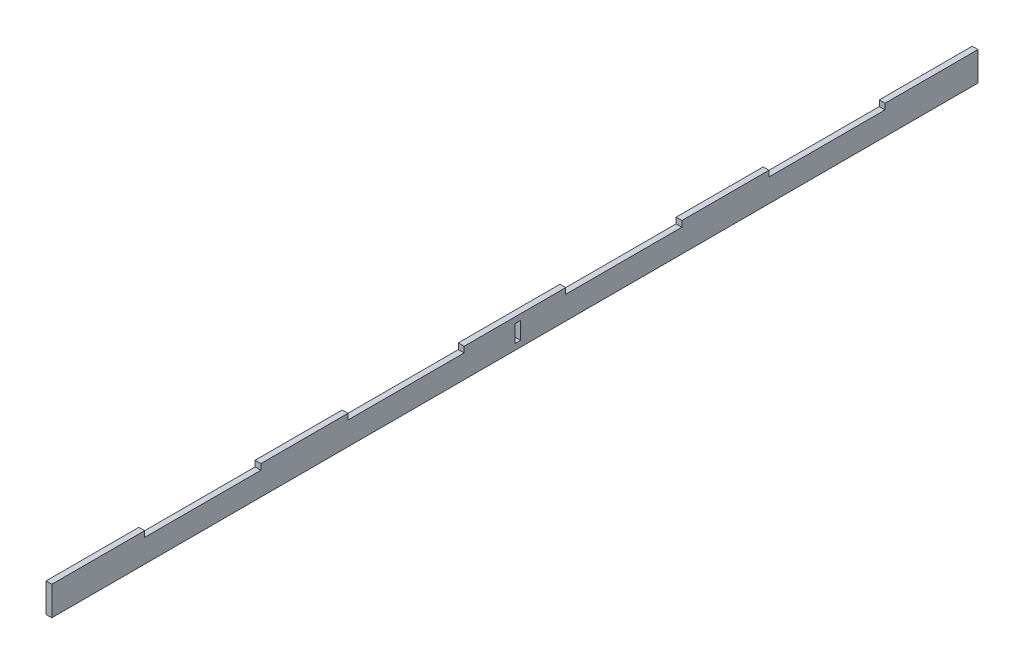
ISO-10303-21;
HEADER;
FILE_DESCRIPTION(('STEP AP214'),'2;1');
FILE_NAME('part.step','',(''),(''),'','','');
FILE_SCHEMA(('AUTOMOTIVE_DESIGN { 1 0 10303 214 1 1 1 1 }'));
ENDSEC;
DATA;
#1=APPLICATION_CONTEXT('core data for automotive mechanical design processes');
#2=APPLICATION_PROTOCOL_DEFINITION('international standard','automotive_design',2000,#1);
#3=PRODUCT_CONTEXT('',#1,'mechanical');
#4=PRODUCT('Part','Part','',(#3));
#5=PRODUCT_RELATED_PRODUCT_CATEGORY('part','',(#4));
#6=PRODUCT_DEFINITION_FORMATION('','',#4);
#7=PRODUCT_DEFINITION_CONTEXT('part definition',#1,'design');
#8=PRODUCT_DEFINITION('design','',#6,#7);
#9=PRODUCT_DEFINITION_SHAPE('','',#8);
#10=(LENGTH_UNIT() NAMED_UNIT(*) SI_UNIT(.MILLI.,.METRE.));
#11=(NAMED_UNIT(*) PLANE_ANGLE_UNIT() SI_UNIT($,.RADIAN.));
#12=(NAMED_UNIT(*) SI_UNIT($,.STERADIAN.) SOLID_ANGLE_UNIT());
#13=UNCERTAINTY_MEASURE_WITH_UNIT(LENGTH_MEASURE(1.E-05),#10,'distance_accuracy_value','');
#14=(GEOMETRIC_REPRESENTATION_CONTEXT(3) GLOBAL_UNCERTAINTY_ASSIGNED_CONTEXT((#13)) GLOBAL_UNIT_ASSIGNED_CONTEXT((#10,
#11,#12)) REPRESENTATION_CONTEXT('',''));
#15=CARTESIAN_POINT('',(0.,0.,0.));
#16=DIRECTION('',(0.,0.,1.));
#17=DIRECTION('',(1.,0.,0.));
#18=AXIS2_PLACEMENT_3D('',#15,#16,#17);
#19=CARTESIAN_POINT('',(2.,5.,159.5));
#20=DIRECTION('',(0.,-1.,0.));
#21=DIRECTION('',(0.,0.,-1.));
#22=AXIS2_PLACEMENT_3D('',#19,#20,#21);
#23=PLANE('',#22);
#24=DIRECTION('',(0.,0.,1.));
#25=VECTOR('',#24,1.);
#26=CARTESIAN_POINT('',(2.,5.,159.5));
#27=LINE('',#26,#25);
#28=CARTESIAN_POINT('',(2.,5.,127.5));
#29=VERTEX_POINT('',#28);
#30=CARTESIAN_POINT('',(2.,5.,159.5));
#31=VERTEX_POINT('',#30);
#32=EDGE_CURVE('E352',#29,#31,#27,.T.);
#33=ORIENTED_EDGE('',*,*,#32,.F.);
#34=DIRECTION('',(1.,0.,0.));
#35=VECTOR('',#34,1.);
#36=CARTESIAN_POINT('',(0.,5.,127.5));
#37=LINE('',#36,#35);
#38=CARTESIAN_POINT('',(0.,5.,127.5));
#39=VERTEX_POINT('',#38);
#40=EDGE_CURVE('E244',#39,#29,#37,.T.);
#41=ORIENTED_EDGE('',*,*,#40,.F.);
#42=DIRECTION('',(0.,0.,1.));
#43=VECTOR('',#42,1.);
#44=CARTESIAN_POINT('',(0.,5.,159.5));
#45=LINE('',#44,#43);
#46=CARTESIAN_POINT('',(0.,5.,159.5));
#47=VERTEX_POINT('',#46);
#48=EDGE_CURVE('E365',#39,#47,#45,.T.);
#49=ORIENTED_EDGE('',*,*,#48,.T.);
#50=DIRECTION('',(-1.,0.,0.));
#51=VECTOR('',#50,1.);
#52=CARTESIAN_POINT('',(2.,5.,159.5));
#53=LINE('',#52,#51);
#54=EDGE_CURVE('E41',#31,#47,#53,.T.);
#55=ORIENTED_EDGE('',*,*,#54,.F.);
#56=EDGE_LOOP('',(#33,#41,#49,#55));
#57=FACE_BOUND('',#56,.T.);
#58=ADVANCED_FACE('F33',(#57),#23,.F.);
#59=CARTESIAN_POINT('',(0.,5.,57.4999999999999));
#60=VERTEX_POINT('',#59);
#61=CARTESIAN_POINT('',(0.,5.,87.4999999999999));
#62=VERTEX_POINT('',#61);
#63=EDGE_CURVE('E438',#60,#62,#45,.T.);
#64=ORIENTED_EDGE('',*,*,#63,.T.);
#65=DIRECTION('',(1.,0.,0.));
#66=VECTOR('',#65,1.);
#67=CARTESIAN_POINT('',(0.,5.,87.4999999999999));
#68=LINE('',#67,#66);
#69=CARTESIAN_POINT('',(2.,5.,87.4999999999999));
#70=VERTEX_POINT('',#69);
#71=EDGE_CURVE('E247',#62,#70,#68,.T.);
#72=ORIENTED_EDGE('',*,*,#71,.T.);
#73=CARTESIAN_POINT('',(2.,5.,57.4999999999999));
#74=VERTEX_POINT('',#73);
#75=EDGE_CURVE('E399',#74,#70,#27,.T.);
#76=ORIENTED_EDGE('',*,*,#75,.F.);
#77=DIRECTION('',(1.,0.,0.));
#78=VECTOR('',#77,1.);
#79=CARTESIAN_POINT('',(0.,5.,57.4999999999999));
#80=LINE('',#79,#78);
#81=EDGE_CURVE('E237',#60,#74,#80,.T.);
#82=ORIENTED_EDGE('',*,*,#81,.F.);
#83=EDGE_LOOP('',(#64,#72,#76,#82));
#84=FACE_BOUND('',#83,.T.);
#85=ADVANCED_FACE('F437',(#84),#23,.F.);
#86=CARTESIAN_POINT('',(0.,5.,-87.4999999999999));
#87=VERTEX_POINT('',#86);
#88=CARTESIAN_POINT('',(0.,5.,-57.4999999999999));
#89=VERTEX_POINT('',#88);
#90=EDGE_CURVE('E370',#87,#89,#45,.T.);
#91=ORIENTED_EDGE('',*,*,#90,.T.);
#92=DIRECTION('',(1.,0.,0.));
#93=VECTOR('',#92,1.);
#94=CARTESIAN_POINT('',(0.,5.,-57.4999999999999));
#95=LINE('',#94,#93);
#96=CARTESIAN_POINT('',(2.,5.,-57.4999999999999));
#97=VERTEX_POINT('',#96);
#98=EDGE_CURVE('E259',#89,#97,#95,.T.);
#99=ORIENTED_EDGE('',*,*,#98,.T.);
#100=CARTESIAN_POINT('',(2.,5.,-87.4999999999999));
#101=VERTEX_POINT('',#100);
#102=EDGE_CURVE('E358',#101,#97,#27,.T.);
#103=ORIENTED_EDGE('',*,*,#102,.F.);
#104=DIRECTION('',(1.,0.,0.));
#105=VECTOR('',#104,1.);
#106=CARTESIAN_POINT('',(0.,5.,-87.4999999999999));
#107=LINE('',#106,#105);
#108=EDGE_CURVE('E303',#87,#101,#107,.T.);
#109=ORIENTED_EDGE('',*,*,#108,.F.);
#110=EDGE_LOOP('',(#91,#99,#103,#109));
#111=FACE_BOUND('',#110,.T.);
#112=ADVANCED_FACE('F410',(#111),#23,.F.);
#113=CARTESIAN_POINT('',(0.,5.,-159.5));
#114=VERTEX_POINT('',#113);
#115=CARTESIAN_POINT('',(0.,5.,-127.5));
#116=VERTEX_POINT('',#115);
#117=EDGE_CURVE('E366',#114,#116,#45,.T.);
#118=ORIENTED_EDGE('',*,*,#117,.T.);
#119=DIRECTION('',(1.,0.,0.));
#120=VECTOR('',#119,1.);
#121=CARTESIAN_POINT('',(0.,5.,-127.5));
#122=LINE('',#121,#120);
#123=CARTESIAN_POINT('',(2.,5.,-127.5));
#124=VERTEX_POINT('',#123);
#125=EDGE_CURVE('E279',#116,#124,#122,.T.);
#126=ORIENTED_EDGE('',*,*,#125,.T.);
#127=CARTESIAN_POINT('',(2.,5.,-159.5));
#128=VERTEX_POINT('',#127);
#129=EDGE_CURVE('E354',#128,#124,#27,.T.);
#130=ORIENTED_EDGE('',*,*,#129,.F.);
#131=DIRECTION('',(-1.,0.,0.));
#132=VECTOR('',#131,1.);
#133=CARTESIAN_POINT('',(2.,5.,-159.5));
#134=LINE('',#133,#132);
#135=EDGE_CURVE('E11',#128,#114,#134,.T.);
#136=ORIENTED_EDGE('',*,*,#135,.T.);
#137=EDGE_LOOP('',(#118,#126,#130,#136));
#138=FACE_BOUND('',#137,.T.);
#139=ADVANCED_FACE('F453',(#138),#23,.F.);
#140=CARTESIAN_POINT('',(2.,-5.,-159.5));
#141=DIRECTION('',(0.,0.,1.));
#142=DIRECTION('',(1.,0.,0.));
#143=AXIS2_PLACEMENT_3D('',#140,#141,#142);
#144=PLANE('',#143);
#145=DIRECTION('',(0.,1.,0.));
#146=VECTOR('',#145,1.);
#147=CARTESIAN_POINT('',(0.,-5.,-159.5));
#148=LINE('',#147,#146);
#149=CARTESIAN_POINT('',(0.,-5.,-159.5));
#150=VERTEX_POINT('',#149);
#151=EDGE_CURVE('E348',#150,#114,#148,.T.);
#152=ORIENTED_EDGE('',*,*,#151,.T.);
#153=ORIENTED_EDGE('',*,*,#135,.F.);
#154=DIRECTION('',(0.,1.,0.));
#155=VECTOR('',#154,1.);
#156=CARTESIAN_POINT('',(2.,-5.,-159.5));
#157=LINE('',#156,#155);
#158=CARTESIAN_POINT('',(2.,-5.,-159.5));
#159=VERTEX_POINT('',#158);
#160=EDGE_CURVE('E349',#159,#128,#157,.T.);
#161=ORIENTED_EDGE('',*,*,#160,.F.);
#162=DIRECTION('',(-1.,0.,0.));
#163=VECTOR('',#162,1.);
#164=CARTESIAN_POINT('',(2.,-5.,-159.5));
#165=LINE('',#164,#163);
#166=EDGE_CURVE('E362',#159,#150,#165,.T.);
#167=ORIENTED_EDGE('',*,*,#166,.T.);
#168=EDGE_LOOP('',(#152,#153,#161,#167));
#169=FACE_BOUND('',#168,.T.);
#170=ADVANCED_FACE('F35',(#169),#144,.F.);
#171=CARTESIAN_POINT('',(0.,5.,-17.4999999999999));
#172=VERTEX_POINT('',#171);
#173=CARTESIAN_POINT('',(0.,5.,17.4999999999999));
#174=VERTEX_POINT('',#173);
#175=EDGE_CURVE('E425',#172,#174,#45,.T.);
#176=ORIENTED_EDGE('',*,*,#175,.T.);
#177=DIRECTION('',(1.,0.,0.));
#178=VECTOR('',#177,1.);
#179=CARTESIAN_POINT('',(0.,5.,17.4999999999999));
#180=LINE('',#179,#178);
#181=CARTESIAN_POINT('',(2.,5.,17.4999999999999));
#182=VERTEX_POINT('',#181);
#183=EDGE_CURVE('E267',#174,#182,#180,.T.);
#184=ORIENTED_EDGE('',*,*,#183,.T.);
#185=CARTESIAN_POINT('',(2.,5.,-17.4999999999999));
#186=VERTEX_POINT('',#185);
#187=EDGE_CURVE('E401',#186,#182,#27,.T.);
#188=ORIENTED_EDGE('',*,*,#187,.F.);
#189=DIRECTION('',(1.,0.,0.));
#190=VECTOR('',#189,1.);
#191=CARTESIAN_POINT('',(0.,5.,-17.4999999999999));
#192=LINE('',#191,#190);
#193=EDGE_CURVE('E285',#172,#186,#192,.T.);
#194=ORIENTED_EDGE('',*,*,#193,.F.);
#195=EDGE_LOOP('',(#176,#184,#188,#194));
#196=FACE_BOUND('',#195,.T.);
#197=ADVANCED_FACE('F424',(#196),#23,.F.);
#198=CARTESIAN_POINT('',(2.,-5.,159.5));
#199=DIRECTION('',(0.,0.,-1.));
#200=DIRECTION('',(-1.,0.,0.));
#201=AXIS2_PLACEMENT_3D('',#198,#199,#200);
#202=PLANE('',#201);
#203=DIRECTION('',(0.,-1.,0.));
#204=VECTOR('',#203,1.);
#205=CARTESIAN_POINT('',(0.,-5.,159.5));
#206=LINE('',#205,#204);
#207=CARTESIAN_POINT('',(0.,-5.,159.5));
#208=VERTEX_POINT('',#207);
#209=EDGE_CURVE('E369',#47,#208,#206,.T.);
#210=ORIENTED_EDGE('',*,*,#209,.T.);
#211=DIRECTION('',(-1.,0.,0.));
#212=VECTOR('',#211,1.);
#213=CARTESIAN_POINT('',(2.,-5.,159.5));
#214=LINE('',#213,#212);
#215=CARTESIAN_POINT('',(2.,-5.,159.5));
#216=VERTEX_POINT('',#215);
#217=EDGE_CURVE('E375',#216,#208,#214,.T.);
#218=ORIENTED_EDGE('',*,*,#217,.F.);
#219=DIRECTION('',(0.,-1.,0.));
#220=VECTOR('',#219,1.);
#221=CARTESIAN_POINT('',(2.,-5.,159.5));
#222=LINE('',#221,#220);
#223=EDGE_CURVE('E357',#31,#216,#222,.T.);
#224=ORIENTED_EDGE('',*,*,#223,.F.);
#225=ORIENTED_EDGE('',*,*,#54,.T.);
#226=EDGE_LOOP('',(#210,#218,#224,#225));
#227=FACE_BOUND('',#226,.T.);
#228=ADVANCED_FACE('F382',(#227),#202,.F.);
#229=CARTESIAN_POINT('',(2.,-5.,159.5));
#230=DIRECTION('',(0.,1.,0.));
#231=DIRECTION('',(0.,0.,1.));
#232=AXIS2_PLACEMENT_3D('',#229,#230,#231);
#233=PLANE('',#232);
#234=DIRECTION('',(0.,0.,-1.));
#235=VECTOR('',#234,1.);
#236=CARTESIAN_POINT('',(0.,-5.,159.5));
#237=LINE('',#236,#235);
#238=EDGE_CURVE('E353',#208,#150,#237,.T.);
#239=ORIENTED_EDGE('',*,*,#238,.T.);
#240=ORIENTED_EDGE('',*,*,#166,.F.);
#241=DIRECTION('',(0.,0.,-1.));
#242=VECTOR('',#241,1.);
#243=CARTESIAN_POINT('',(2.,-5.,159.5));
#244=LINE('',#243,#242);
#245=EDGE_CURVE('E360',#216,#159,#244,.T.);
#246=ORIENTED_EDGE('',*,*,#245,.F.);
#247=ORIENTED_EDGE('',*,*,#217,.T.);
#248=EDGE_LOOP('',(#239,#240,#246,#247));
#249=FACE_BOUND('',#248,.T.);
#250=ADVANCED_FACE('F391',(#249),#233,.F.);
#251=CARTESIAN_POINT('',(2.,0.,0.));
#252=DIRECTION('',(-1.,0.,0.));
#253=DIRECTION('',(0.,0.,1.));
#254=AXIS2_PLACEMENT_3D('',#251,#252,#253);
#255=PLANE('',#254);
#256=DIRECTION('',(0.,0.,1.));
#257=VECTOR('',#256,1.);
#258=CARTESIAN_POINT('',(2.,-3.,0.));
#259=LINE('',#258,#257);
#260=CARTESIAN_POINT('',(2.,-3.,-2.));
#261=VERTEX_POINT('',#260);
#262=CARTESIAN_POINT('',(2.,-3.,0.));
#263=VERTEX_POINT('',#262);
#264=EDGE_CURVE('E219',#261,#263,#259,.T.);
#265=ORIENTED_EDGE('',*,*,#264,.T.);
#266=DIRECTION('',(0.,1.,0.));
#267=VECTOR('',#266,1.);
#268=CARTESIAN_POINT('',(2.,0.,0.));
#269=LINE('',#268,#267);
#270=CARTESIAN_POINT('',(2.,3.,0.));
#271=VERTEX_POINT('',#270);
#272=EDGE_CURVE('E200',#263,#271,#269,.T.);
#273=ORIENTED_EDGE('',*,*,#272,.T.);
#274=DIRECTION('',(0.,0.,-1.));
#275=VECTOR('',#274,1.);
#276=CARTESIAN_POINT('',(2.,3.,0.));
#277=LINE('',#276,#275);
#278=CARTESIAN_POINT('',(2.,3.,-2.));
#279=VERTEX_POINT('',#278);
#280=EDGE_CURVE('E228',#271,#279,#277,.T.);
#281=ORIENTED_EDGE('',*,*,#280,.T.);
#282=DIRECTION('',(0.,-1.,0.));
#283=VECTOR('',#282,1.);
#284=CARTESIAN_POINT('',(2.,0.,-2.));
#285=LINE('',#284,#283);
#286=EDGE_CURVE('E225',#279,#261,#285,.T.);
#287=ORIENTED_EDGE('',*,*,#286,.T.);
#288=EDGE_LOOP('',(#265,#273,#281,#287));
#289=FACE_BOUND('',#288,.T.);
#290=DIRECTION('',(0.,0.,1.));
#291=VECTOR('',#290,1.);
#292=CARTESIAN_POINT('',(2.,3.,0.));
#293=LINE('',#292,#291);
#294=CARTESIAN_POINT('',(2.,3.,87.4999999999999));
#295=VERTEX_POINT('',#294);
#296=CARTESIAN_POINT('',(2.,3.,127.5));
#297=VERTEX_POINT('',#296);
#298=EDGE_CURVE('E339',#295,#297,#293,.T.);
#299=ORIENTED_EDGE('',*,*,#298,.T.);
#300=DIRECTION('',(0.,1.,0.));
#301=VECTOR('',#300,1.);
#302=CARTESIAN_POINT('',(2.,-3.53883589099268E-12,127.5));
#303=LINE('',#302,#301);
#304=EDGE_CURVE('E345',#297,#29,#303,.T.);
#305=ORIENTED_EDGE('',*,*,#304,.T.);
#306=ORIENTED_EDGE('',*,*,#32,.T.);
#307=ORIENTED_EDGE('',*,*,#223,.T.);
#308=ORIENTED_EDGE('',*,*,#245,.T.);
#309=ORIENTED_EDGE('',*,*,#160,.T.);
#310=ORIENTED_EDGE('',*,*,#129,.T.);
#311=DIRECTION('',(0.,-1.,0.));
#312=VECTOR('',#311,1.);
#313=CARTESIAN_POINT('',(2.,-3.53883589099268E-12,-127.5));
#314=LINE('',#313,#312);
#315=CARTESIAN_POINT('',(2.,3.,-127.5));
#316=VERTEX_POINT('',#315);
#317=EDGE_CURVE('E318',#124,#316,#314,.T.);
#318=ORIENTED_EDGE('',*,*,#317,.T.);
#319=DIRECTION('',(0.,0.,1.));
#320=VECTOR('',#319,1.);
#321=CARTESIAN_POINT('',(2.,3.,0.));
#322=LINE('',#321,#320);
#323=CARTESIAN_POINT('',(2.,3.,-87.4999999999999));
#324=VERTEX_POINT('',#323);
#325=EDGE_CURVE('E315',#316,#324,#322,.T.);
#326=ORIENTED_EDGE('',*,*,#325,.T.);
#327=DIRECTION('',(0.,1.,0.));
#328=VECTOR('',#327,1.);
#329=CARTESIAN_POINT('',(2.,0.,-87.4999999999999));
#330=LINE('',#329,#328);
#331=EDGE_CURVE('E246',#324,#101,#330,.T.);
#332=ORIENTED_EDGE('',*,*,#331,.T.);
#333=ORIENTED_EDGE('',*,*,#102,.T.);
#334=DIRECTION('',(0.,-1.,0.));
#335=VECTOR('',#334,1.);
#336=CARTESIAN_POINT('',(2.,0.,-57.4999999999999));
#337=LINE('',#336,#335);
#338=CARTESIAN_POINT('',(2.,3.,-57.4999999999999));
#339=VERTEX_POINT('',#338);
#340=EDGE_CURVE('E327',#97,#339,#337,.T.);
#341=ORIENTED_EDGE('',*,*,#340,.T.);
#342=DIRECTION('',(0.,0.,1.));
#343=VECTOR('',#342,1.);
#344=CARTESIAN_POINT('',(2.,3.,0.));
#345=LINE('',#344,#343);
#346=CARTESIAN_POINT('',(2.,3.,-17.4999999999999));
#347=VERTEX_POINT('',#346);
#348=EDGE_CURVE('E324',#339,#347,#345,.T.);
#349=ORIENTED_EDGE('',*,*,#348,.T.);
#350=DIRECTION('',(0.,1.,0.));
#351=VECTOR('',#350,1.);
#352=CARTESIAN_POINT('',(2.,0.,-17.4999999999999));
#353=LINE('',#352,#351);
#354=EDGE_CURVE('E321',#347,#186,#353,.T.);
#355=ORIENTED_EDGE('',*,*,#354,.T.);
#356=ORIENTED_EDGE('',*,*,#187,.T.);
#357=DIRECTION('',(0.,-1.,0.));
#358=VECTOR('',#357,1.);
#359=CARTESIAN_POINT('',(2.,0.,17.4999999999999));
#360=LINE('',#359,#358);
#361=CARTESIAN_POINT('',(2.,3.,17.4999999999999));
#362=VERTEX_POINT('',#361);
#363=EDGE_CURVE('E333',#182,#362,#360,.T.);
#364=ORIENTED_EDGE('',*,*,#363,.T.);
#365=DIRECTION('',(0.,0.,1.));
#366=VECTOR('',#365,1.);
#367=CARTESIAN_POINT('',(2.,3.,0.));
#368=LINE('',#367,#366);
#369=CARTESIAN_POINT('',(2.,3.,57.4999999999999));
#370=VERTEX_POINT('',#369);
#371=EDGE_CURVE('E330',#362,#370,#368,.T.);
#372=ORIENTED_EDGE('',*,*,#371,.T.);
#373=DIRECTION('',(0.,1.,0.));
#374=VECTOR('',#373,1.);
#375=CARTESIAN_POINT('',(2.,0.,57.4999999999999));
#376=LINE('',#375,#374);
#377=EDGE_CURVE('E336',#370,#74,#376,.T.);
#378=ORIENTED_EDGE('',*,*,#377,.T.);
#379=ORIENTED_EDGE('',*,*,#75,.T.);
#380=DIRECTION('',(0.,-1.,0.));
#381=VECTOR('',#380,1.);
#382=CARTESIAN_POINT('',(2.,0.,87.4999999999999));
#383=LINE('',#382,#381);
#384=EDGE_CURVE('E342',#70,#295,#383,.T.);
#385=ORIENTED_EDGE('',*,*,#384,.T.);
#386=EDGE_LOOP('',(#299,#305,#306,#307,#308,#309,#310,#318,#326,#332,#333,#341,#349,#355,#356,
#364,#372,#378,#379,#385));
#387=FACE_BOUND('',#386,.T.);
#388=ADVANCED_FACE('F397',(#289,#387),#255,.F.);
#389=CARTESIAN_POINT('',(0.,0.,0.));
#390=DIRECTION('',(-1.,0.,0.));
#391=DIRECTION('',(0.,0.,1.));
#392=AXIS2_PLACEMENT_3D('',#389,#390,#391);
#393=PLANE('',#392);
#394=DIRECTION('',(0.,-1.,0.));
#395=VECTOR('',#394,1.);
#396=CARTESIAN_POINT('',(0.,3.,0.));
#397=LINE('',#396,#395);
#398=CARTESIAN_POINT('',(0.,3.,0.));
#399=VERTEX_POINT('',#398);
#400=CARTESIAN_POINT('',(0.,-3.,0.));
#401=VERTEX_POINT('',#400);
#402=EDGE_CURVE('E197',#399,#401,#397,.T.);
#403=ORIENTED_EDGE('',*,*,#402,.T.);
#404=DIRECTION('',(0.,0.,-1.));
#405=VECTOR('',#404,1.);
#406=CARTESIAN_POINT('',(0.,-3.,0.));
#407=LINE('',#406,#405);
#408=CARTESIAN_POINT('',(0.,-3.,-2.));
#409=VERTEX_POINT('',#408);
#410=EDGE_CURVE('E206',#401,#409,#407,.T.);
#411=ORIENTED_EDGE('',*,*,#410,.T.);
#412=DIRECTION('',(0.,1.,0.));
#413=VECTOR('',#412,1.);
#414=CARTESIAN_POINT('',(0.,3.,-2.));
#415=LINE('',#414,#413);
#416=CARTESIAN_POINT('',(0.,3.,-2.));
#417=VERTEX_POINT('',#416);
#418=EDGE_CURVE('E56',#409,#417,#415,.T.);
#419=ORIENTED_EDGE('',*,*,#418,.T.);
#420=DIRECTION('',(0.,0.,1.));
#421=VECTOR('',#420,1.);
#422=CARTESIAN_POINT('',(0.,3.,0.));
#423=LINE('',#422,#421);
#424=EDGE_CURVE('E203',#417,#399,#423,.T.);
#425=ORIENTED_EDGE('',*,*,#424,.T.);
#426=EDGE_LOOP('',(#403,#411,#419,#425));
#427=FACE_BOUND('',#426,.T.);
#428=DIRECTION('',(0.,-1.,0.));
#429=VECTOR('',#428,1.);
#430=CARTESIAN_POINT('',(0.,5.,127.5));
#431=LINE('',#430,#429);
#432=CARTESIAN_POINT('',(0.,3.,127.5));
#433=VERTEX_POINT('',#432);
#434=EDGE_CURVE('E233',#39,#433,#431,.T.);
#435=ORIENTED_EDGE('',*,*,#434,.T.);
#436=DIRECTION('',(0.,0.,-1.));
#437=VECTOR('',#436,1.);
#438=CARTESIAN_POINT('',(0.,3.,127.5));
#439=LINE('',#438,#437);
#440=CARTESIAN_POINT('',(0.,3.,87.4999999999999));
#441=VERTEX_POINT('',#440);
#442=EDGE_CURVE('E236',#433,#441,#439,.T.);
#443=ORIENTED_EDGE('',*,*,#442,.T.);
#444=DIRECTION('',(0.,1.,0.));
#445=VECTOR('',#444,1.);
#446=CARTESIAN_POINT('',(0.,5.,87.4999999999999));
#447=LINE('',#446,#445);
#448=EDGE_CURVE('E240',#441,#62,#447,.T.);
#449=ORIENTED_EDGE('',*,*,#448,.T.);
#450=ORIENTED_EDGE('',*,*,#63,.F.);
#451=DIRECTION('',(0.,-1.,0.));
#452=VECTOR('',#451,1.);
#453=CARTESIAN_POINT('',(0.,5.,57.4999999999999));
#454=LINE('',#453,#452);
#455=CARTESIAN_POINT('',(0.,3.,57.4999999999999));
#456=VERTEX_POINT('',#455);
#457=EDGE_CURVE('E255',#60,#456,#454,.T.);
#458=ORIENTED_EDGE('',*,*,#457,.T.);
#459=DIRECTION('',(0.,0.,-1.));
#460=VECTOR('',#459,1.);
#461=CARTESIAN_POINT('',(0.,3.,57.4999999999999));
#462=LINE('',#461,#460);
#463=CARTESIAN_POINT('',(0.,3.,17.4999999999999));
#464=VERTEX_POINT('',#463);
#465=EDGE_CURVE('E258',#456,#464,#462,.T.);
#466=ORIENTED_EDGE('',*,*,#465,.T.);
#467=DIRECTION('',(0.,1.,0.));
#468=VECTOR('',#467,1.);
#469=CARTESIAN_POINT('',(0.,5.,17.4999999999999));
#470=LINE('',#469,#468);
#471=EDGE_CURVE('E262',#464,#174,#470,.T.);
#472=ORIENTED_EDGE('',*,*,#471,.T.);
#473=ORIENTED_EDGE('',*,*,#175,.F.);
#474=DIRECTION('',(0.,-1.,0.));
#475=VECTOR('',#474,1.);
#476=CARTESIAN_POINT('',(0.,5.,-17.4999999999999));
#477=LINE('',#476,#475);
#478=CARTESIAN_POINT('',(0.,3.,-17.4999999999999));
#479=VERTEX_POINT('',#478);
#480=EDGE_CURVE('E275',#172,#479,#477,.T.);
#481=ORIENTED_EDGE('',*,*,#480,.T.);
#482=DIRECTION('',(0.,0.,-1.));
#483=VECTOR('',#482,1.);
#484=CARTESIAN_POINT('',(0.,3.,-57.4999999999999));
#485=LINE('',#484,#483);
#486=CARTESIAN_POINT('',(0.,3.,-57.4999999999999));
#487=VERTEX_POINT('',#486);
#488=EDGE_CURVE('E278',#479,#487,#485,.T.);
#489=ORIENTED_EDGE('',*,*,#488,.T.);
#490=DIRECTION('',(0.,1.,0.));
#491=VECTOR('',#490,1.);
#492=CARTESIAN_POINT('',(0.,5.,-57.4999999999999));
#493=LINE('',#492,#491);
#494=EDGE_CURVE('E282',#487,#89,#493,.T.);
#495=ORIENTED_EDGE('',*,*,#494,.T.);
#496=ORIENTED_EDGE('',*,*,#90,.F.);
#497=DIRECTION('',(0.,-1.,0.));
#498=VECTOR('',#497,1.);
#499=CARTESIAN_POINT('',(0.,5.,-87.4999999999999));
#500=LINE('',#499,#498);
#501=CARTESIAN_POINT('',(0.,3.,-87.4999999999999));
#502=VERTEX_POINT('',#501);
#503=EDGE_CURVE('E232',#87,#502,#500,.T.);
#504=ORIENTED_EDGE('',*,*,#503,.T.);
#505=DIRECTION('',(0.,0.,-1.));
#506=VECTOR('',#505,1.);
#507=CARTESIAN_POINT('',(0.,3.,-127.5));
#508=LINE('',#507,#506);
#509=CARTESIAN_POINT('',(0.,3.,-127.5));
#510=VERTEX_POINT('',#509);
#511=EDGE_CURVE('E297',#502,#510,#508,.T.);
#512=ORIENTED_EDGE('',*,*,#511,.T.);
#513=DIRECTION('',(0.,1.,0.));
#514=VECTOR('',#513,1.);
#515=CARTESIAN_POINT('',(0.,5.,-127.5));
#516=LINE('',#515,#514);
#517=EDGE_CURVE('E300',#510,#116,#516,.T.);
#518=ORIENTED_EDGE('',*,*,#517,.T.);
#519=ORIENTED_EDGE('',*,*,#117,.F.);
#520=ORIENTED_EDGE('',*,*,#151,.F.);
#521=ORIENTED_EDGE('',*,*,#238,.F.);
#522=ORIENTED_EDGE('',*,*,#209,.F.);
#523=ORIENTED_EDGE('',*,*,#48,.F.);
#524=EDGE_LOOP('',(#435,#443,#449,#450,#458,#466,#472,#473,#481,#489,#495,#496,#504,#512,#518,
#519,#520,#521,#522,#523));
#525=FACE_BOUND('',#524,.T.);
#526=ADVANCED_FACE('F210',(#427,#525),#393,.T.);
#527=CARTESIAN_POINT('',(0.,5.,-127.5));
#528=DIRECTION('',(0.,0.,-1.));
#529=DIRECTION('',(0.,1.,0.));
#530=AXIS2_PLACEMENT_3D('',#527,#528,#529);
#531=PLANE('',#530);
#532=ORIENTED_EDGE('',*,*,#125,.F.);
#533=ORIENTED_EDGE('',*,*,#517,.F.);
#534=DIRECTION('',(1.,0.,0.));
#535=VECTOR('',#534,1.);
#536=CARTESIAN_POINT('',(0.,3.,-127.5));
#537=LINE('',#536,#535);
#538=EDGE_CURVE('E306',#510,#316,#537,.T.);
#539=ORIENTED_EDGE('',*,*,#538,.T.);
#540=ORIENTED_EDGE('',*,*,#317,.F.);
#541=EDGE_LOOP('',(#532,#533,#539,#540));
#542=FACE_BOUND('',#541,.T.);
#543=ADVANCED_FACE('F465',(#542),#531,.F.);
#544=CARTESIAN_POINT('',(0.,3.,-127.5));
#545=DIRECTION('',(0.,-1.,0.));
#546=DIRECTION('',(0.,0.,-1.));
#547=AXIS2_PLACEMENT_3D('',#544,#545,#546);
#548=PLANE('',#547);
#549=ORIENTED_EDGE('',*,*,#538,.F.);
#550=ORIENTED_EDGE('',*,*,#511,.F.);
#551=DIRECTION('',(1.,0.,0.));
#552=VECTOR('',#551,1.);
#553=CARTESIAN_POINT('',(0.,3.,-87.4999999999999));
#554=LINE('',#553,#552);
#555=EDGE_CURVE('E309',#502,#324,#554,.T.);
#556=ORIENTED_EDGE('',*,*,#555,.T.);
#557=ORIENTED_EDGE('',*,*,#325,.F.);
#558=EDGE_LOOP('',(#549,#550,#556,#557));
#559=FACE_BOUND('',#558,.T.);
#560=ADVANCED_FACE('F467',(#559),#548,.F.);
#561=CARTESIAN_POINT('',(0.,5.,-87.4999999999999));
#562=DIRECTION('',(0.,0.,1.));
#563=DIRECTION('',(1.,0.,0.));
#564=AXIS2_PLACEMENT_3D('',#561,#562,#563);
#565=PLANE('',#564);
#566=ORIENTED_EDGE('',*,*,#555,.F.);
#567=ORIENTED_EDGE('',*,*,#503,.F.);
#568=ORIENTED_EDGE('',*,*,#108,.T.);
#569=ORIENTED_EDGE('',*,*,#331,.F.);
#570=EDGE_LOOP('',(#566,#567,#568,#569));
#571=FACE_BOUND('',#570,.T.);
#572=ADVANCED_FACE('F470',(#571),#565,.F.);
#573=CARTESIAN_POINT('',(0.,5.,-57.4999999999999));
#574=DIRECTION('',(0.,0.,-1.));
#575=DIRECTION('',(-1.,0.,0.));
#576=AXIS2_PLACEMENT_3D('',#573,#574,#575);
#577=PLANE('',#576);
#578=ORIENTED_EDGE('',*,*,#98,.F.);
#579=ORIENTED_EDGE('',*,*,#494,.F.);
#580=DIRECTION('',(1.,0.,0.));
#581=VECTOR('',#580,1.);
#582=CARTESIAN_POINT('',(0.,3.,-57.4999999999999));
#583=LINE('',#582,#581);
#584=EDGE_CURVE('E288',#487,#339,#583,.T.);
#585=ORIENTED_EDGE('',*,*,#584,.T.);
#586=ORIENTED_EDGE('',*,*,#340,.F.);
#587=EDGE_LOOP('',(#578,#579,#585,#586));
#588=FACE_BOUND('',#587,.T.);
#589=ADVANCED_FACE('F414',(#588),#577,.F.);
#590=CARTESIAN_POINT('',(0.,3.,-57.4999999999999));
#591=DIRECTION('',(0.,-1.,0.));
#592=DIRECTION('',(0.,0.,-1.));
#593=AXIS2_PLACEMENT_3D('',#590,#591,#592);
#594=PLANE('',#593);
#595=ORIENTED_EDGE('',*,*,#584,.F.);
#596=ORIENTED_EDGE('',*,*,#488,.F.);
#597=DIRECTION('',(1.,0.,0.));
#598=VECTOR('',#597,1.);
#599=CARTESIAN_POINT('',(0.,3.,-17.4999999999999));
#600=LINE('',#599,#598);
#601=EDGE_CURVE('E291',#479,#347,#600,.T.);
#602=ORIENTED_EDGE('',*,*,#601,.T.);
#603=ORIENTED_EDGE('',*,*,#348,.F.);
#604=EDGE_LOOP('',(#595,#596,#602,#603));
#605=FACE_BOUND('',#604,.T.);
#606=ADVANCED_FACE('F418',(#605),#594,.F.);
#607=CARTESIAN_POINT('',(0.,5.,-17.4999999999999));
#608=DIRECTION('',(0.,0.,1.));
#609=DIRECTION('',(1.,0.,0.));
#610=AXIS2_PLACEMENT_3D('',#607,#608,#609);
#611=PLANE('',#610);
#612=ORIENTED_EDGE('',*,*,#601,.F.);
#613=ORIENTED_EDGE('',*,*,#480,.F.);
#614=ORIENTED_EDGE('',*,*,#193,.T.);
#615=ORIENTED_EDGE('',*,*,#354,.F.);
#616=EDGE_LOOP('',(#612,#613,#614,#615));
#617=FACE_BOUND('',#616,.T.);
#618=ADVANCED_FACE('F420',(#617),#611,.F.);
#619=CARTESIAN_POINT('',(0.,5.,57.4999999999999));
#620=DIRECTION('',(0.,0.,1.));
#621=DIRECTION('',(1.,0.,0.));
#622=AXIS2_PLACEMENT_3D('',#619,#620,#621);
#623=PLANE('',#622);
#624=DIRECTION('',(1.,0.,0.));
#625=VECTOR('',#624,1.);
#626=CARTESIAN_POINT('',(0.,3.,57.4999999999999));
#627=LINE('',#626,#625);
#628=EDGE_CURVE('E265',#456,#370,#627,.T.);
#629=ORIENTED_EDGE('',*,*,#628,.F.);
#630=ORIENTED_EDGE('',*,*,#457,.F.);
#631=ORIENTED_EDGE('',*,*,#81,.T.);
#632=ORIENTED_EDGE('',*,*,#377,.F.);
#633=EDGE_LOOP('',(#629,#630,#631,#632));
#634=FACE_BOUND('',#633,.T.);
#635=ADVANCED_FACE('F537',(#634),#623,.F.);
#636=CARTESIAN_POINT('',(0.,5.,17.4999999999999));
#637=DIRECTION('',(0.,0.,-1.));
#638=DIRECTION('',(-1.,0.,0.));
#639=AXIS2_PLACEMENT_3D('',#636,#637,#638);
#640=PLANE('',#639);
#641=ORIENTED_EDGE('',*,*,#183,.F.);
#642=ORIENTED_EDGE('',*,*,#471,.F.);
#643=DIRECTION('',(1.,0.,0.));
#644=VECTOR('',#643,1.);
#645=CARTESIAN_POINT('',(0.,3.,17.4999999999999));
#646=LINE('',#645,#644);
#647=EDGE_CURVE('E270',#464,#362,#646,.T.);
#648=ORIENTED_EDGE('',*,*,#647,.T.);
#649=ORIENTED_EDGE('',*,*,#363,.F.);
#650=EDGE_LOOP('',(#641,#642,#648,#649));
#651=FACE_BOUND('',#650,.T.);
#652=ADVANCED_FACE('F427',(#651),#640,.F.);
#653=CARTESIAN_POINT('',(0.,3.,57.4999999999999));
#654=DIRECTION('',(0.,-1.,0.));
#655=DIRECTION('',(0.,0.,-1.));
#656=AXIS2_PLACEMENT_3D('',#653,#654,#655);
#657=PLANE('',#656);
#658=ORIENTED_EDGE('',*,*,#647,.F.);
#659=ORIENTED_EDGE('',*,*,#465,.F.);
#660=ORIENTED_EDGE('',*,*,#628,.T.);
#661=ORIENTED_EDGE('',*,*,#371,.F.);
#662=EDGE_LOOP('',(#658,#659,#660,#661));
#663=FACE_BOUND('',#662,.T.);
#664=ADVANCED_FACE('F432',(#663),#657,.F.);
#665=CARTESIAN_POINT('',(0.,5.,127.5));
#666=DIRECTION('',(0.,0.,1.));
#667=DIRECTION('',(0.,-1.,0.));
#668=AXIS2_PLACEMENT_3D('',#665,#666,#667);
#669=PLANE('',#668);
#670=DIRECTION('',(1.,0.,0.));
#671=VECTOR('',#670,1.);
#672=CARTESIAN_POINT('',(0.,3.,127.5));
#673=LINE('',#672,#671);
#674=EDGE_CURVE('E243',#433,#297,#673,.T.);
#675=ORIENTED_EDGE('',*,*,#674,.F.);
#676=ORIENTED_EDGE('',*,*,#434,.F.);
#677=ORIENTED_EDGE('',*,*,#40,.T.);
#678=ORIENTED_EDGE('',*,*,#304,.F.);
#679=EDGE_LOOP('',(#675,#676,#677,#678));
#680=FACE_BOUND('',#679,.T.);
#681=ADVANCED_FACE('F446',(#680),#669,.F.);
#682=CARTESIAN_POINT('',(0.,5.,87.4999999999999));
#683=DIRECTION('',(0.,0.,-1.));
#684=DIRECTION('',(-1.,0.,0.));
#685=AXIS2_PLACEMENT_3D('',#682,#683,#684);
#686=PLANE('',#685);
#687=ORIENTED_EDGE('',*,*,#71,.F.);
#688=ORIENTED_EDGE('',*,*,#448,.F.);
#689=DIRECTION('',(1.,0.,0.));
#690=VECTOR('',#689,1.);
#691=CARTESIAN_POINT('',(0.,3.,87.4999999999999));
#692=LINE('',#691,#690);
#693=EDGE_CURVE('E250',#441,#295,#692,.T.);
#694=ORIENTED_EDGE('',*,*,#693,.T.);
#695=ORIENTED_EDGE('',*,*,#384,.F.);
#696=EDGE_LOOP('',(#687,#688,#694,#695));
#697=FACE_BOUND('',#696,.T.);
#698=ADVANCED_FACE('F440',(#697),#686,.F.);
#699=CARTESIAN_POINT('',(0.,3.,127.5));
#700=DIRECTION('',(0.,-1.,0.));
#701=DIRECTION('',(0.,0.,-1.));
#702=AXIS2_PLACEMENT_3D('',#699,#700,#701);
#703=PLANE('',#702);
#704=ORIENTED_EDGE('',*,*,#693,.F.);
#705=ORIENTED_EDGE('',*,*,#442,.F.);
#706=ORIENTED_EDGE('',*,*,#674,.T.);
#707=ORIENTED_EDGE('',*,*,#298,.F.);
#708=EDGE_LOOP('',(#704,#705,#706,#707));
#709=FACE_BOUND('',#708,.T.);
#710=ADVANCED_FACE('F444',(#709),#703,.F.);
#711=CARTESIAN_POINT('',(0.,3.,0.));
#712=DIRECTION('',(0.,0.,1.));
#713=DIRECTION('',(0.,-1.,0.));
#714=AXIS2_PLACEMENT_3D('',#711,#712,#713);
#715=PLANE('',#714);
#716=DIRECTION('',(1.,0.,0.));
#717=VECTOR('',#716,1.);
#718=CARTESIAN_POINT('',(0.,-3.,0.));
#719=LINE('',#718,#717);
#720=EDGE_CURVE('E48',#401,#263,#719,.T.);
#721=ORIENTED_EDGE('',*,*,#720,.F.);
#722=ORIENTED_EDGE('',*,*,#402,.F.);
#723=DIRECTION('',(1.,0.,0.));
#724=VECTOR('',#723,1.);
#725=CARTESIAN_POINT('',(0.,3.,0.));
#726=LINE('',#725,#724);
#727=EDGE_CURVE('E217',#399,#271,#726,.T.);
#728=ORIENTED_EDGE('',*,*,#727,.T.);
#729=ORIENTED_EDGE('',*,*,#272,.F.);
#730=EDGE_LOOP('',(#721,#722,#728,#729));
#731=FACE_BOUND('',#730,.T.);
#732=ADVANCED_FACE('F194',(#731),#715,.F.);
#733=CARTESIAN_POINT('',(0.,3.,0.));
#734=DIRECTION('',(0.,1.,0.));
#735=DIRECTION('',(0.,0.,1.));
#736=AXIS2_PLACEMENT_3D('',#733,#734,#735);
#737=PLANE('',#736);
#738=ORIENTED_EDGE('',*,*,#727,.F.);
#739=ORIENTED_EDGE('',*,*,#424,.F.);
#740=DIRECTION('',(1.,0.,0.));
#741=VECTOR('',#740,1.);
#742=CARTESIAN_POINT('',(0.,3.,-2.));
#743=LINE('',#742,#741);
#744=EDGE_CURVE('E220',#417,#279,#743,.T.);
#745=ORIENTED_EDGE('',*,*,#744,.T.);
#746=ORIENTED_EDGE('',*,*,#280,.F.);
#747=EDGE_LOOP('',(#738,#739,#745,#746));
#748=FACE_BOUND('',#747,.T.);
#749=ADVANCED_FACE('F592',(#748),#737,.F.);
#750=CARTESIAN_POINT('',(0.,3.,-2.));
#751=DIRECTION('',(0.,0.,-1.));
#752=DIRECTION('',(0.,1.,0.));
#753=AXIS2_PLACEMENT_3D('',#750,#751,#752);
#754=PLANE('',#753);
#755=ORIENTED_EDGE('',*,*,#744,.F.);
#756=ORIENTED_EDGE('',*,*,#418,.F.);
#757=DIRECTION('',(1.,0.,0.));
#758=VECTOR('',#757,1.);
#759=CARTESIAN_POINT('',(0.,-3.,-2.));
#760=LINE('',#759,#758);
#761=EDGE_CURVE('E202',#409,#261,#760,.T.);
#762=ORIENTED_EDGE('',*,*,#761,.T.);
#763=ORIENTED_EDGE('',*,*,#286,.F.);
#764=EDGE_LOOP('',(#755,#756,#762,#763));
#765=FACE_BOUND('',#764,.T.);
#766=ADVANCED_FACE('F598',(#765),#754,.F.);
#767=CARTESIAN_POINT('',(0.,-3.,0.));
#768=DIRECTION('',(0.,-1.,0.));
#769=DIRECTION('',(0.,0.,-1.));
#770=AXIS2_PLACEMENT_3D('',#767,#768,#769);
#771=PLANE('',#770);
#772=ORIENTED_EDGE('',*,*,#761,.F.);
#773=ORIENTED_EDGE('',*,*,#410,.F.);
#774=ORIENTED_EDGE('',*,*,#720,.T.);
#775=ORIENTED_EDGE('',*,*,#264,.F.);
#776=EDGE_LOOP('',(#772,#773,#774,#775));
#777=FACE_BOUND('',#776,.T.);
#778=ADVANCED_FACE('F207',(#777),#771,.F.);
#779=CLOSED_SHELL('',(#58,#85,#112,#139,#170,#197,#228,#250,#388,#526,#543,#560,#572,#589,#606,
#618,#635,#652,#664,#681,#698,#710,#732,#749,#766,#778));
#780=MANIFOLD_SOLID_BREP('B2',#779);
#781=ADVANCED_BREP_SHAPE_REPRESENTATION('',(#18,#780),#14);
#782=SHAPE_DEFINITION_REPRESENTATION(#9,#781);
ENDSEC;
END-ISO-10303-21;
